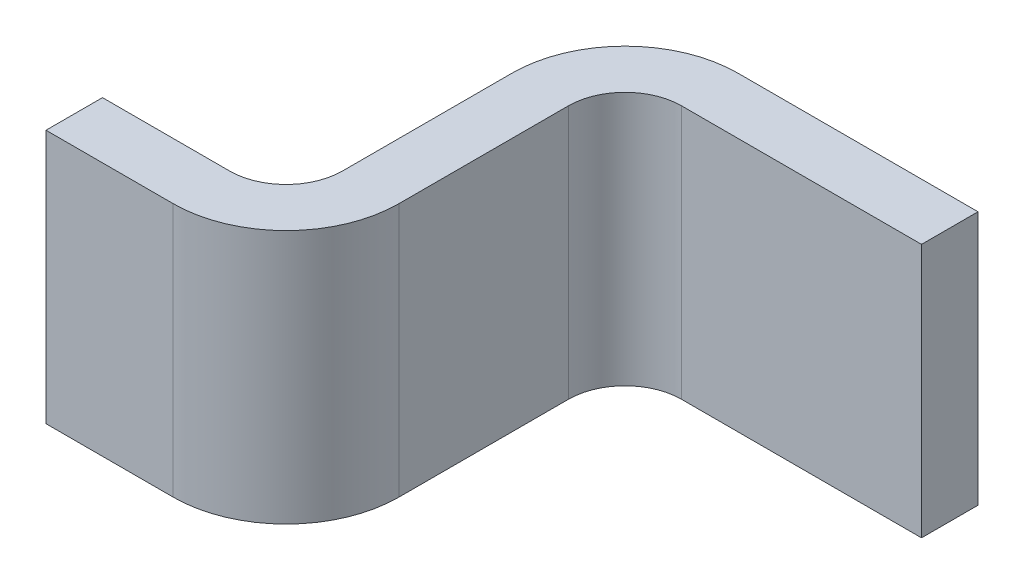
ISO-10303-21;
HEADER;
FILE_DESCRIPTION(('STEP AP214'),'2;1');
FILE_NAME('part.step','',(''),(''),'','','');
FILE_SCHEMA(('AUTOMOTIVE_DESIGN { 1 0 10303 214 1 1 1 1 }'));
ENDSEC;
DATA;
#1=APPLICATION_CONTEXT('core data for automotive mechanical design processes');
#2=APPLICATION_PROTOCOL_DEFINITION('international standard','automotive_design',2000,#1);
#3=PRODUCT_CONTEXT('',#1,'mechanical');
#4=PRODUCT('Part','Part','',(#3));
#5=PRODUCT_RELATED_PRODUCT_CATEGORY('part','',(#4));
#6=PRODUCT_DEFINITION_FORMATION('','',#4);
#7=PRODUCT_DEFINITION_CONTEXT('part definition',#1,'design');
#8=PRODUCT_DEFINITION('design','',#6,#7);
#9=PRODUCT_DEFINITION_SHAPE('','',#8);
#10=(LENGTH_UNIT() NAMED_UNIT(*) SI_UNIT(.MILLI.,.METRE.));
#11=(NAMED_UNIT(*) PLANE_ANGLE_UNIT() SI_UNIT($,.RADIAN.));
#12=(NAMED_UNIT(*) SI_UNIT($,.STERADIAN.) SOLID_ANGLE_UNIT());
#13=UNCERTAINTY_MEASURE_WITH_UNIT(LENGTH_MEASURE(1.E-05),#10,'distance_accuracy_value','');
#14=(GEOMETRIC_REPRESENTATION_CONTEXT(3) GLOBAL_UNCERTAINTY_ASSIGNED_CONTEXT((#13)) GLOBAL_UNIT_ASSIGNED_CONTEXT((#10,
#11,#12)) REPRESENTATION_CONTEXT('',''));
#15=CARTESIAN_POINT('',(0.,0.,0.));
#16=DIRECTION('',(0.,0.,1.));
#17=DIRECTION('',(1.,0.,0.));
#18=AXIS2_PLACEMENT_3D('',#15,#16,#17);
#19=CARTESIAN_POINT('',(0.,0.225,0.7));
#20=DIRECTION('',(0.,0.,-1.));
#21=DIRECTION('',(-1.,0.,0.));
#22=AXIS2_PLACEMENT_3D('',#19,#20,#21);
#23=PLANE('',#22);
#24=DIRECTION('',(1.,0.,0.));
#25=VECTOR('',#24,1.);
#26=CARTESIAN_POINT('',(0.,0.225,0.7));
#27=LINE('',#26,#25);
#28=CARTESIAN_POINT('',(0.225,0.225,0.7));
#29=VERTEX_POINT('',#28);
#30=CARTESIAN_POINT('',(0.,0.225,0.7));
#31=VERTEX_POINT('',#30);
#32=EDGE_CURVE('E104',#29,#31,#27,.F.);
#33=ORIENTED_EDGE('',*,*,#32,.T.);
#34=DIRECTION('',(0.,1.,0.));
#35=VECTOR('',#34,1.);
#36=CARTESIAN_POINT('',(0.,-0.225,0.7));
#37=LINE('',#36,#35);
#38=CARTESIAN_POINT('',(0.,-0.225,0.7));
#39=VERTEX_POINT('',#38);
#40=EDGE_CURVE('E113',#39,#31,#37,.T.);
#41=ORIENTED_EDGE('',*,*,#40,.F.);
#42=DIRECTION('',(1.,0.,0.));
#43=VECTOR('',#42,1.);
#44=CARTESIAN_POINT('',(0.,-0.225,0.7));
#45=LINE('',#44,#43);
#46=CARTESIAN_POINT('',(0.225,-0.225,0.7));
#47=VERTEX_POINT('',#46);
#48=EDGE_CURVE('E118',#39,#47,#45,.T.);
#49=ORIENTED_EDGE('',*,*,#48,.T.);
#50=DIRECTION('',(0.,1.,0.));
#51=VECTOR('',#50,1.);
#52=CARTESIAN_POINT('',(0.225,0.225,0.7));
#53=LINE('',#52,#51);
#54=EDGE_CURVE('E116',#29,#47,#53,.F.);
#55=ORIENTED_EDGE('',*,*,#54,.F.);
#56=EDGE_LOOP('',(#33,#41,#49,#55));
#57=FACE_BOUND('',#56,.T.);
#58=ADVANCED_FACE('F17',(#57),#23,.F.);
#59=CARTESIAN_POINT('',(0.,-0.225,0.6));
#60=DIRECTION('',(-1.,0.,0.));
#61=DIRECTION('',(0.,0.,1.));
#62=AXIS2_PLACEMENT_3D('',#59,#60,#61);
#63=PLANE('',#62);
#64=DIRECTION('',(0.,0.,1.));
#65=VECTOR('',#64,1.);
#66=CARTESIAN_POINT('',(0.,0.225,0.6));
#67=LINE('',#66,#65);
#68=CARTESIAN_POINT('',(0.,0.225,0.6));
#69=VERTEX_POINT('',#68);
#70=EDGE_CURVE('E111',#31,#69,#67,.F.);
#71=ORIENTED_EDGE('',*,*,#70,.T.);
#72=DIRECTION('',(0.,1.,0.));
#73=VECTOR('',#72,1.);
#74=CARTESIAN_POINT('',(0.,-0.225,0.6));
#75=LINE('',#74,#73);
#76=CARTESIAN_POINT('',(0.,-0.225,0.6));
#77=VERTEX_POINT('',#76);
#78=EDGE_CURVE('E127',#69,#77,#75,.F.);
#79=ORIENTED_EDGE('',*,*,#78,.T.);
#80=DIRECTION('',(0.,0.,1.));
#81=VECTOR('',#80,1.);
#82=CARTESIAN_POINT('',(0.,-0.225,0.7));
#83=LINE('',#82,#81);
#84=EDGE_CURVE('E140',#77,#39,#83,.T.);
#85=ORIENTED_EDGE('',*,*,#84,.T.);
#86=ORIENTED_EDGE('',*,*,#40,.T.);
#87=EDGE_LOOP('',(#71,#79,#85,#86));
#88=FACE_BOUND('',#87,.T.);
#89=ADVANCED_FACE('F277',(#88),#63,.T.);
#90=CARTESIAN_POINT('',(0.225,0.225,0.5));
#91=DIRECTION('',(0.,1.,0.));
#92=DIRECTION('',(0.,0.,1.));
#93=AXIS2_PLACEMENT_3D('',#90,#91,#92);
#94=CYLINDRICAL_SURFACE('',#93,0.2);
#95=CARTESIAN_POINT('',(0.225,0.225,0.5));
#96=DIRECTION('',(0.,1.,0.));
#97=DIRECTION('',(0.,0.,1.));
#98=AXIS2_PLACEMENT_3D('',#95,#96,#97);
#99=CIRCLE('',#98,0.2);
#100=CARTESIAN_POINT('',(0.425,0.225,0.5));
#101=VERTEX_POINT('',#100);
#102=EDGE_CURVE('E20',#29,#101,#99,.T.);
#103=ORIENTED_EDGE('',*,*,#102,.F.);
#104=ORIENTED_EDGE('',*,*,#54,.T.);
#105=CARTESIAN_POINT('',(0.225,-0.225,0.5));
#106=DIRECTION('',(0.,1.,0.));
#107=DIRECTION('',(0.,0.,1.));
#108=AXIS2_PLACEMENT_3D('',#105,#106,#107);
#109=CIRCLE('',#108,0.2);
#110=CARTESIAN_POINT('',(0.425,-0.225,0.5));
#111=VERTEX_POINT('',#110);
#112=EDGE_CURVE('E178',#111,#47,#109,.F.);
#113=ORIENTED_EDGE('',*,*,#112,.F.);
#114=DIRECTION('',(0.,1.,0.));
#115=VECTOR('',#114,1.);
#116=CARTESIAN_POINT('',(0.425,0.225,0.5));
#117=LINE('',#116,#115);
#118=EDGE_CURVE('E124',#111,#101,#117,.T.);
#119=ORIENTED_EDGE('',*,*,#118,.T.);
#120=EDGE_LOOP('',(#103,#104,#113,#119));
#121=FACE_BOUND('',#120,.T.);
#122=ADVANCED_FACE('F123',(#121),#94,.T.);
#123=CARTESIAN_POINT('',(0.,-0.225,0.6));
#124=DIRECTION('',(0.,0.,1.));
#125=DIRECTION('',(1.,0.,0.));
#126=AXIS2_PLACEMENT_3D('',#123,#124,#125);
#127=PLANE('',#126);
#128=DIRECTION('',(1.,0.,0.));
#129=VECTOR('',#128,1.);
#130=CARTESIAN_POINT('',(0.,-0.225,0.6));
#131=LINE('',#130,#129);
#132=CARTESIAN_POINT('',(0.225,-0.225,0.6));
#133=VERTEX_POINT('',#132);
#134=EDGE_CURVE('E131',#77,#133,#131,.T.);
#135=ORIENTED_EDGE('',*,*,#134,.F.);
#136=ORIENTED_EDGE('',*,*,#78,.F.);
#137=DIRECTION('',(1.,0.,0.));
#138=VECTOR('',#137,1.);
#139=CARTESIAN_POINT('',(0.,0.225,0.6));
#140=LINE('',#139,#138);
#141=CARTESIAN_POINT('',(0.225,0.225,0.6));
#142=VERTEX_POINT('',#141);
#143=EDGE_CURVE('E126',#142,#69,#140,.F.);
#144=ORIENTED_EDGE('',*,*,#143,.F.);
#145=DIRECTION('',(0.,1.,0.));
#146=VECTOR('',#145,1.);
#147=CARTESIAN_POINT('',(0.225,-0.225,0.6));
#148=LINE('',#147,#146);
#149=EDGE_CURVE('E175',#142,#133,#148,.F.);
#150=ORIENTED_EDGE('',*,*,#149,.T.);
#151=EDGE_LOOP('',(#135,#136,#144,#150));
#152=FACE_BOUND('',#151,.T.);
#153=ADVANCED_FACE('F271',(#152),#127,.F.);
#154=CARTESIAN_POINT('',(0.425,0.225,0.5));
#155=DIRECTION('',(-1.,0.,0.));
#156=DIRECTION('',(0.,0.,1.));
#157=AXIS2_PLACEMENT_3D('',#154,#155,#156);
#158=PLANE('',#157);
#159=DIRECTION('',(0.,0.,-1.));
#160=VECTOR('',#159,1.);
#161=CARTESIAN_POINT('',(0.425,0.225,0.5));
#162=LINE('',#161,#160);
#163=CARTESIAN_POINT('',(0.425,0.225,0.2));
#164=VERTEX_POINT('',#163);
#165=EDGE_CURVE('E177',#164,#101,#162,.F.);
#166=ORIENTED_EDGE('',*,*,#165,.T.);
#167=ORIENTED_EDGE('',*,*,#118,.F.);
#168=DIRECTION('',(0.,0.,1.));
#169=VECTOR('',#168,1.);
#170=CARTESIAN_POINT('',(0.425,-0.225,0.5));
#171=LINE('',#170,#169);
#172=CARTESIAN_POINT('',(0.425,-0.225,0.2));
#173=VERTEX_POINT('',#172);
#174=EDGE_CURVE('E174',#111,#173,#171,.F.);
#175=ORIENTED_EDGE('',*,*,#174,.T.);
#176=DIRECTION('',(0.,-1.,0.));
#177=VECTOR('',#176,1.);
#178=CARTESIAN_POINT('',(0.425,0.225,0.2));
#179=LINE('',#178,#177);
#180=EDGE_CURVE('E171',#173,#164,#179,.F.);
#181=ORIENTED_EDGE('',*,*,#180,.T.);
#182=EDGE_LOOP('',(#166,#167,#175,#181));
#183=FACE_BOUND('',#182,.T.);
#184=ADVANCED_FACE('F267',(#183),#158,.F.);
#185=CARTESIAN_POINT('',(0.225,-0.225,0.5));
#186=DIRECTION('',(0.,1.,0.));
#187=DIRECTION('',(0.,0.,1.));
#188=AXIS2_PLACEMENT_3D('',#185,#186,#187);
#189=CYLINDRICAL_SURFACE('',#188,0.1);
#190=CARTESIAN_POINT('',(0.225,-0.225,0.5));
#191=DIRECTION('',(0.,1.,0.));
#192=DIRECTION('',(0.,0.,1.));
#193=AXIS2_PLACEMENT_3D('',#190,#191,#192);
#194=CIRCLE('',#193,0.1);
#195=CARTESIAN_POINT('',(0.325,-0.225,0.5));
#196=VERTEX_POINT('',#195);
#197=EDGE_CURVE('E172',#133,#196,#194,.T.);
#198=ORIENTED_EDGE('',*,*,#197,.F.);
#199=ORIENTED_EDGE('',*,*,#149,.F.);
#200=CARTESIAN_POINT('',(0.225,0.225,0.5));
#201=DIRECTION('',(0.,1.,0.));
#202=DIRECTION('',(0.,0.,1.));
#203=AXIS2_PLACEMENT_3D('',#200,#201,#202);
#204=CIRCLE('',#203,0.1);
#205=CARTESIAN_POINT('',(0.325,0.225,0.5));
#206=VERTEX_POINT('',#205);
#207=EDGE_CURVE('E176',#206,#142,#204,.F.);
#208=ORIENTED_EDGE('',*,*,#207,.F.);
#209=DIRECTION('',(0.,1.,0.));
#210=VECTOR('',#209,1.);
#211=CARTESIAN_POINT('',(0.325,-0.225,0.5));
#212=LINE('',#211,#210);
#213=EDGE_CURVE('E188',#206,#196,#212,.F.);
#214=ORIENTED_EDGE('',*,*,#213,.T.);
#215=EDGE_LOOP('',(#198,#199,#208,#214));
#216=FACE_BOUND('',#215,.T.);
#217=ADVANCED_FACE('F263',(#216),#189,.F.);
#218=CARTESIAN_POINT('',(0.525,0.225,0.2));
#219=DIRECTION('',(0.,-1.,0.));
#220=DIRECTION('',(0.,0.,-1.));
#221=AXIS2_PLACEMENT_3D('',#218,#219,#220);
#222=CYLINDRICAL_SURFACE('',#221,0.1);
#223=CARTESIAN_POINT('',(0.525,0.225,0.2));
#224=DIRECTION('',(0.,-1.,0.));
#225=DIRECTION('',(0.,0.,-1.));
#226=AXIS2_PLACEMENT_3D('',#223,#224,#225);
#227=CIRCLE('',#226,0.1);
#228=CARTESIAN_POINT('',(0.525,0.225,0.1));
#229=VERTEX_POINT('',#228);
#230=EDGE_CURVE('E168',#164,#229,#227,.T.);
#231=ORIENTED_EDGE('',*,*,#230,.F.);
#232=ORIENTED_EDGE('',*,*,#180,.F.);
#233=CARTESIAN_POINT('',(0.525,-0.225,0.2));
#234=DIRECTION('',(0.,-1.,0.));
#235=DIRECTION('',(0.,0.,-1.));
#236=AXIS2_PLACEMENT_3D('',#233,#234,#235);
#237=CIRCLE('',#236,0.1);
#238=CARTESIAN_POINT('',(0.525,-0.225,0.1));
#239=VERTEX_POINT('',#238);
#240=EDGE_CURVE('E163',#239,#173,#237,.F.);
#241=ORIENTED_EDGE('',*,*,#240,.F.);
#242=DIRECTION('',(0.,1.,0.));
#243=VECTOR('',#242,1.);
#244=CARTESIAN_POINT('',(0.525,0.225,0.1));
#245=LINE('',#244,#243);
#246=EDGE_CURVE('E166',#239,#229,#245,.T.);
#247=ORIENTED_EDGE('',*,*,#246,.T.);
#248=EDGE_LOOP('',(#231,#232,#241,#247));
#249=FACE_BOUND('',#248,.T.);
#250=ADVANCED_FACE('F259',(#249),#222,.F.);
#251=CARTESIAN_POINT('',(0.325,-0.225,0.5));
#252=DIRECTION('',(1.,0.,0.));
#253=DIRECTION('',(0.,0.,-1.));
#254=AXIS2_PLACEMENT_3D('',#251,#252,#253);
#255=PLANE('',#254);
#256=DIRECTION('',(0.,0.,-1.));
#257=VECTOR('',#256,1.);
#258=CARTESIAN_POINT('',(0.325,-0.225,0.5));
#259=LINE('',#258,#257);
#260=CARTESIAN_POINT('',(0.325,-0.225,0.2));
#261=VERTEX_POINT('',#260);
#262=EDGE_CURVE('E167',#196,#261,#259,.T.);
#263=ORIENTED_EDGE('',*,*,#262,.F.);
#264=ORIENTED_EDGE('',*,*,#213,.F.);
#265=DIRECTION('',(0.,0.,-1.));
#266=VECTOR('',#265,1.);
#267=CARTESIAN_POINT('',(0.325,0.225,0.5));
#268=LINE('',#267,#266);
#269=CARTESIAN_POINT('',(0.325,0.225,0.2));
#270=VERTEX_POINT('',#269);
#271=EDGE_CURVE('E170',#270,#206,#268,.F.);
#272=ORIENTED_EDGE('',*,*,#271,.F.);
#273=DIRECTION('',(0.,-1.,0.));
#274=VECTOR('',#273,1.);
#275=CARTESIAN_POINT('',(0.325,-0.225,0.2));
#276=LINE('',#275,#274);
#277=EDGE_CURVE('E159',#261,#270,#276,.F.);
#278=ORIENTED_EDGE('',*,*,#277,.F.);
#279=EDGE_LOOP('',(#263,#264,#272,#278));
#280=FACE_BOUND('',#279,.T.);
#281=ADVANCED_FACE('F255',(#280),#255,.F.);
#282=CARTESIAN_POINT('',(0.525,0.225,0.1));
#283=DIRECTION('',(0.,0.,-1.));
#284=DIRECTION('',(-1.,0.,0.));
#285=AXIS2_PLACEMENT_3D('',#282,#283,#284);
#286=PLANE('',#285);
#287=DIRECTION('',(1.,0.,0.));
#288=VECTOR('',#287,1.);
#289=CARTESIAN_POINT('',(0.525,0.225,0.1));
#290=LINE('',#289,#288);
#291=CARTESIAN_POINT('',(0.95,0.225,0.1));
#292=VERTEX_POINT('',#291);
#293=EDGE_CURVE('E162',#292,#229,#290,.F.);
#294=ORIENTED_EDGE('',*,*,#293,.T.);
#295=ORIENTED_EDGE('',*,*,#246,.F.);
#296=DIRECTION('',(1.,0.,0.));
#297=VECTOR('',#296,1.);
#298=CARTESIAN_POINT('',(0.525,-0.225,0.1));
#299=LINE('',#298,#297);
#300=CARTESIAN_POINT('',(0.95,-0.225,0.1));
#301=VERTEX_POINT('',#300);
#302=EDGE_CURVE('E216',#239,#301,#299,.T.);
#303=ORIENTED_EDGE('',*,*,#302,.T.);
#304=DIRECTION('',(0.,1.,0.));
#305=VECTOR('',#304,1.);
#306=CARTESIAN_POINT('',(0.95,-0.225,0.1));
#307=LINE('',#306,#305);
#308=EDGE_CURVE('E197',#301,#292,#307,.T.);
#309=ORIENTED_EDGE('',*,*,#308,.T.);
#310=EDGE_LOOP('',(#294,#295,#303,#309));
#311=FACE_BOUND('',#310,.T.);
#312=ADVANCED_FACE('F252',(#311),#286,.F.);
#313=CARTESIAN_POINT('',(0.525,0.225,0.));
#314=DIRECTION('',(0.,-1.,0.));
#315=DIRECTION('',(0.,0.,-1.));
#316=AXIS2_PLACEMENT_3D('',#313,#314,#315);
#317=PLANE('',#316);
#318=DIRECTION('',(1.,0.,0.));
#319=VECTOR('',#318,1.);
#320=CARTESIAN_POINT('',(0.525,0.225,0.));
#321=LINE('',#320,#319);
#322=CARTESIAN_POINT('',(0.95,0.225,0.));
#323=VERTEX_POINT('',#322);
#324=CARTESIAN_POINT('',(0.525,0.225,0.));
#325=VERTEX_POINT('',#324);
#326=EDGE_CURVE('E205',#323,#325,#321,.F.);
#327=ORIENTED_EDGE('',*,*,#326,.T.);
#328=CARTESIAN_POINT('',(0.525,0.225,0.2));
#329=DIRECTION('',(0.,-1.,0.));
#330=DIRECTION('',(0.,0.,-1.));
#331=AXIS2_PLACEMENT_3D('',#328,#329,#330);
#332=CIRCLE('',#331,0.2);
#333=EDGE_CURVE('E160',#270,#325,#332,.T.);
#334=ORIENTED_EDGE('',*,*,#333,.F.);
#335=ORIENTED_EDGE('',*,*,#271,.T.);
#336=ORIENTED_EDGE('',*,*,#207,.T.);
#337=ORIENTED_EDGE('',*,*,#143,.T.);
#338=ORIENTED_EDGE('',*,*,#70,.F.);
#339=ORIENTED_EDGE('',*,*,#32,.F.);
#340=ORIENTED_EDGE('',*,*,#102,.T.);
#341=ORIENTED_EDGE('',*,*,#165,.F.);
#342=ORIENTED_EDGE('',*,*,#230,.T.);
#343=ORIENTED_EDGE('',*,*,#293,.F.);
#344=DIRECTION('',(0.,0.,1.));
#345=VECTOR('',#344,1.);
#346=CARTESIAN_POINT('',(0.95,0.225,0.));
#347=LINE('',#346,#345);
#348=EDGE_CURVE('E200',#292,#323,#347,.F.);
#349=ORIENTED_EDGE('',*,*,#348,.T.);
#350=EDGE_LOOP('',(#327,#334,#335,#336,#337,#338,#339,#340,#341,#342,#343,#349));
#351=FACE_BOUND('',#350,.T.);
#352=ADVANCED_FACE('F107',(#351),#317,.F.);
#353=CARTESIAN_POINT('',(0.525,-0.225,0.2));
#354=DIRECTION('',(0.,-1.,0.));
#355=DIRECTION('',(0.,0.,-1.));
#356=AXIS2_PLACEMENT_3D('',#353,#354,#355);
#357=CYLINDRICAL_SURFACE('',#356,0.2);
#358=CARTESIAN_POINT('',(0.525,-0.225,0.2));
#359=DIRECTION('',(0.,-1.,0.));
#360=DIRECTION('',(0.,0.,-1.));
#361=AXIS2_PLACEMENT_3D('',#358,#359,#360);
#362=CIRCLE('',#361,0.2);
#363=CARTESIAN_POINT('',(0.525,-0.225,0.));
#364=VERTEX_POINT('',#363);
#365=EDGE_CURVE('E157',#364,#261,#362,.F.);
#366=ORIENTED_EDGE('',*,*,#365,.T.);
#367=ORIENTED_EDGE('',*,*,#277,.T.);
#368=ORIENTED_EDGE('',*,*,#333,.T.);
#369=DIRECTION('',(0.,1.,0.));
#370=VECTOR('',#369,1.);
#371=CARTESIAN_POINT('',(0.525,-0.225,0.));
#372=LINE('',#371,#370);
#373=EDGE_CURVE('E211',#325,#364,#372,.F.);
#374=ORIENTED_EDGE('',*,*,#373,.T.);
#375=EDGE_LOOP('',(#366,#367,#368,#374));
#376=FACE_BOUND('',#375,.T.);
#377=ADVANCED_FACE('F233',(#376),#357,.T.);
#378=CARTESIAN_POINT('',(0.525,-0.225,0.1));
#379=DIRECTION('',(0.,1.,0.));
#380=DIRECTION('',(0.,0.,1.));
#381=AXIS2_PLACEMENT_3D('',#378,#379,#380);
#382=PLANE('',#381);
#383=ORIENTED_EDGE('',*,*,#302,.F.);
#384=ORIENTED_EDGE('',*,*,#240,.T.);
#385=ORIENTED_EDGE('',*,*,#174,.F.);
#386=ORIENTED_EDGE('',*,*,#112,.T.);
#387=ORIENTED_EDGE('',*,*,#48,.F.);
#388=ORIENTED_EDGE('',*,*,#84,.F.);
#389=ORIENTED_EDGE('',*,*,#134,.T.);
#390=ORIENTED_EDGE('',*,*,#197,.T.);
#391=ORIENTED_EDGE('',*,*,#262,.T.);
#392=ORIENTED_EDGE('',*,*,#365,.F.);
#393=DIRECTION('',(1.,0.,0.));
#394=VECTOR('',#393,1.);
#395=CARTESIAN_POINT('',(0.525,-0.225,0.));
#396=LINE('',#395,#394);
#397=CARTESIAN_POINT('',(0.95,-0.225,0.));
#398=VERTEX_POINT('',#397);
#399=EDGE_CURVE('E26',#364,#398,#396,.T.);
#400=ORIENTED_EDGE('',*,*,#399,.T.);
#401=DIRECTION('',(0.,0.,1.));
#402=VECTOR('',#401,1.);
#403=CARTESIAN_POINT('',(0.95,-0.225,0.));
#404=LINE('',#403,#402);
#405=EDGE_CURVE('E34',#398,#301,#404,.T.);
#406=ORIENTED_EDGE('',*,*,#405,.T.);
#407=EDGE_LOOP('',(#383,#384,#385,#386,#387,#388,#389,#390,#391,#392,#400,#406));
#408=FACE_BOUND('',#407,.T.);
#409=ADVANCED_FACE('F227',(#408),#382,.F.);
#410=CARTESIAN_POINT('',(0.95,-0.225,0.));
#411=DIRECTION('',(-1.,0.,0.));
#412=DIRECTION('',(0.,0.,1.));
#413=AXIS2_PLACEMENT_3D('',#410,#411,#412);
#414=PLANE('',#413);
#415=ORIENTED_EDGE('',*,*,#348,.F.);
#416=ORIENTED_EDGE('',*,*,#308,.F.);
#417=ORIENTED_EDGE('',*,*,#405,.F.);
#418=DIRECTION('',(0.,1.,0.));
#419=VECTOR('',#418,1.);
#420=CARTESIAN_POINT('',(0.95,-0.225,0.));
#421=LINE('',#420,#419);
#422=EDGE_CURVE('E11',#398,#323,#421,.T.);
#423=ORIENTED_EDGE('',*,*,#422,.T.);
#424=EDGE_LOOP('',(#415,#416,#417,#423));
#425=FACE_BOUND('',#424,.T.);
#426=ADVANCED_FACE('F237',(#425),#414,.F.);
#427=CARTESIAN_POINT('',(0.525,-0.225,0.));
#428=DIRECTION('',(0.,0.,1.));
#429=DIRECTION('',(1.,0.,0.));
#430=AXIS2_PLACEMENT_3D('',#427,#428,#429);
#431=PLANE('',#430);
#432=ORIENTED_EDGE('',*,*,#399,.F.);
#433=ORIENTED_EDGE('',*,*,#373,.F.);
#434=ORIENTED_EDGE('',*,*,#326,.F.);
#435=ORIENTED_EDGE('',*,*,#422,.F.);
#436=EDGE_LOOP('',(#432,#433,#434,#435));
#437=FACE_BOUND('',#436,.T.);
#438=ADVANCED_FACE('F231',(#437),#431,.F.);
#439=CLOSED_SHELL('',(#58,#89,#122,#153,#184,#217,#250,#281,#312,#352,#377,#409,#426,#438));
#440=MANIFOLD_SOLID_BREP('B1',#439);
#441=ADVANCED_BREP_SHAPE_REPRESENTATION('',(#18,#440),#14);
#442=SHAPE_DEFINITION_REPRESENTATION(#9,#441);
ENDSEC;
END-ISO-10303-21;
